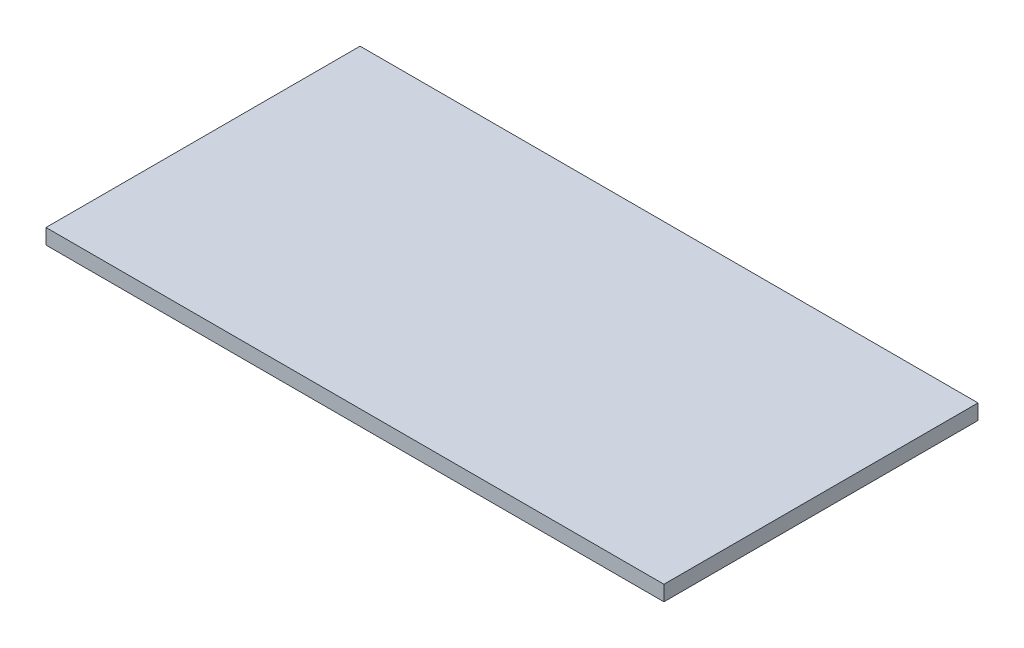
ISO-10303-21;
HEADER;
FILE_DESCRIPTION(('STEP AP214'),'2;1');
FILE_NAME('part.step','',(''),(''),'','','');
FILE_SCHEMA(('AUTOMOTIVE_DESIGN { 1 0 10303 214 1 1 1 1 }'));
ENDSEC;
DATA;
#1=APPLICATION_CONTEXT('core data for automotive mechanical design processes');
#2=APPLICATION_PROTOCOL_DEFINITION('international standard','automotive_design',2000,#1);
#3=PRODUCT_CONTEXT('',#1,'mechanical');
#4=PRODUCT('Part','Part','',(#3));
#5=PRODUCT_RELATED_PRODUCT_CATEGORY('part','',(#4));
#6=PRODUCT_DEFINITION_FORMATION('','',#4);
#7=PRODUCT_DEFINITION_CONTEXT('part definition',#1,'design');
#8=PRODUCT_DEFINITION('design','',#6,#7);
#9=PRODUCT_DEFINITION_SHAPE('','',#8);
#10=(LENGTH_UNIT() NAMED_UNIT(*) SI_UNIT(.MILLI.,.METRE.));
#11=(NAMED_UNIT(*) PLANE_ANGLE_UNIT() SI_UNIT($,.RADIAN.));
#12=(NAMED_UNIT(*) SI_UNIT($,.STERADIAN.) SOLID_ANGLE_UNIT());
#13=UNCERTAINTY_MEASURE_WITH_UNIT(LENGTH_MEASURE(1.E-05),#10,'distance_accuracy_value','');
#14=(GEOMETRIC_REPRESENTATION_CONTEXT(3) GLOBAL_UNCERTAINTY_ASSIGNED_CONTEXT((#13)) GLOBAL_UNIT_ASSIGNED_CONTEXT((#10,
#11,#12)) REPRESENTATION_CONTEXT('',''));
#15=CARTESIAN_POINT('',(0.,0.,0.));
#16=DIRECTION('',(0.,0.,1.));
#17=DIRECTION('',(1.,0.,0.));
#18=AXIS2_PLACEMENT_3D('',#15,#16,#17);
#19=CARTESIAN_POINT('',(0.,5.08,-104.6));
#20=DIRECTION('',(0.,0.,-1.));
#21=DIRECTION('',(-1.,0.,0.));
#22=AXIS2_PLACEMENT_3D('',#19,#20,#21);
#23=PLANE('',#22);
#24=DIRECTION('',(1.,0.,0.));
#25=VECTOR('',#24,1.);
#26=CARTESIAN_POINT('',(0.,0.,-104.6));
#27=LINE('',#26,#25);
#28=CARTESIAN_POINT('',(0.,0.,-104.6));
#29=VERTEX_POINT('',#28);
#30=CARTESIAN_POINT('',(205.8,0.,-104.6));
#31=VERTEX_POINT('',#30);
#32=EDGE_CURVE('E109',#29,#31,#27,.T.);
#33=ORIENTED_EDGE('',*,*,#32,.F.);
#34=DIRECTION('',(0.,-1.,0.));
#35=VECTOR('',#34,1.);
#36=CARTESIAN_POINT('',(0.,5.08,-104.6));
#37=LINE('',#36,#35);
#38=CARTESIAN_POINT('',(0.,5.08,-104.6));
#39=VERTEX_POINT('',#38);
#40=EDGE_CURVE('E11',#39,#29,#37,.T.);
#41=ORIENTED_EDGE('',*,*,#40,.F.);
#42=DIRECTION('',(1.,0.,0.));
#43=VECTOR('',#42,1.);
#44=CARTESIAN_POINT('',(0.,5.08,-104.6));
#45=LINE('',#44,#43);
#46=CARTESIAN_POINT('',(205.8,5.08,-104.6));
#47=VERTEX_POINT('',#46);
#48=EDGE_CURVE('E101',#39,#47,#45,.T.);
#49=ORIENTED_EDGE('',*,*,#48,.T.);
#50=DIRECTION('',(0.,-1.,0.));
#51=VECTOR('',#50,1.);
#52=CARTESIAN_POINT('',(205.8,5.08,-104.6));
#53=LINE('',#52,#51);
#54=EDGE_CURVE('E42',#47,#31,#53,.T.);
#55=ORIENTED_EDGE('',*,*,#54,.T.);
#56=EDGE_LOOP('',(#33,#41,#49,#55));
#57=FACE_BOUND('',#56,.T.);
#58=ADVANCED_FACE('F39',(#57),#23,.T.);
#59=CARTESIAN_POINT('',(0.,5.08,0.));
#60=DIRECTION('',(-1.,0.,0.));
#61=DIRECTION('',(0.,0.,1.));
#62=AXIS2_PLACEMENT_3D('',#59,#60,#61);
#63=PLANE('',#62);
#64=DIRECTION('',(0.,0.,-1.));
#65=VECTOR('',#64,1.);
#66=CARTESIAN_POINT('',(0.,0.,0.));
#67=LINE('',#66,#65);
#68=CARTESIAN_POINT('',(0.,0.,0.));
#69=VERTEX_POINT('',#68);
#70=EDGE_CURVE('E104',#69,#29,#67,.T.);
#71=ORIENTED_EDGE('',*,*,#70,.F.);
#72=DIRECTION('',(0.,-1.,0.));
#73=VECTOR('',#72,1.);
#74=CARTESIAN_POINT('',(0.,5.08,0.));
#75=LINE('',#74,#73);
#76=CARTESIAN_POINT('',(0.,5.08,0.));
#77=VERTEX_POINT('',#76);
#78=EDGE_CURVE('E49',#77,#69,#75,.T.);
#79=ORIENTED_EDGE('',*,*,#78,.F.);
#80=DIRECTION('',(0.,0.,-1.));
#81=VECTOR('',#80,1.);
#82=CARTESIAN_POINT('',(0.,5.08,0.));
#83=LINE('',#82,#81);
#84=EDGE_CURVE('E88',#77,#39,#83,.T.);
#85=ORIENTED_EDGE('',*,*,#84,.T.);
#86=ORIENTED_EDGE('',*,*,#40,.T.);
#87=EDGE_LOOP('',(#71,#79,#85,#86));
#88=FACE_BOUND('',#87,.T.);
#89=ADVANCED_FACE('F125',(#88),#63,.T.);
#90=CARTESIAN_POINT('',(0.,5.08,0.));
#91=DIRECTION('',(0.,0.,-1.));
#92=DIRECTION('',(-1.,0.,0.));
#93=AXIS2_PLACEMENT_3D('',#90,#91,#92);
#94=PLANE('',#93);
#95=DIRECTION('',(1.,0.,0.));
#96=VECTOR('',#95,1.);
#97=CARTESIAN_POINT('',(0.,0.,0.));
#98=LINE('',#97,#96);
#99=CARTESIAN_POINT('',(205.8,0.,0.));
#100=VERTEX_POINT('',#99);
#101=EDGE_CURVE('E94',#69,#100,#98,.T.);
#102=ORIENTED_EDGE('',*,*,#101,.T.);
#103=DIRECTION('',(0.,-1.,0.));
#104=VECTOR('',#103,1.);
#105=CARTESIAN_POINT('',(205.8,5.08,0.));
#106=LINE('',#105,#104);
#107=CARTESIAN_POINT('',(205.8,5.08,0.));
#108=VERTEX_POINT('',#107);
#109=EDGE_CURVE('E92',#108,#100,#106,.T.);
#110=ORIENTED_EDGE('',*,*,#109,.F.);
#111=DIRECTION('',(1.,0.,0.));
#112=VECTOR('',#111,1.);
#113=CARTESIAN_POINT('',(0.,5.08,0.));
#114=LINE('',#113,#112);
#115=EDGE_CURVE('E85',#77,#108,#114,.T.);
#116=ORIENTED_EDGE('',*,*,#115,.F.);
#117=ORIENTED_EDGE('',*,*,#78,.T.);
#118=EDGE_LOOP('',(#102,#110,#116,#117));
#119=FACE_BOUND('',#118,.T.);
#120=ADVANCED_FACE('F93',(#119),#94,.F.);
#121=CARTESIAN_POINT('',(205.8,5.08,0.));
#122=DIRECTION('',(-1.,0.,0.));
#123=DIRECTION('',(0.,0.,1.));
#124=AXIS2_PLACEMENT_3D('',#121,#122,#123);
#125=PLANE('',#124);
#126=DIRECTION('',(0.,0.,-1.));
#127=VECTOR('',#126,1.);
#128=CARTESIAN_POINT('',(205.8,0.,0.));
#129=LINE('',#128,#127);
#130=EDGE_CURVE('E113',#100,#31,#129,.T.);
#131=ORIENTED_EDGE('',*,*,#130,.T.);
#132=ORIENTED_EDGE('',*,*,#54,.F.);
#133=DIRECTION('',(0.,0.,-1.));
#134=VECTOR('',#133,1.);
#135=CARTESIAN_POINT('',(205.8,5.08,0.));
#136=LINE('',#135,#134);
#137=EDGE_CURVE('E82',#108,#47,#136,.T.);
#138=ORIENTED_EDGE('',*,*,#137,.F.);
#139=ORIENTED_EDGE('',*,*,#109,.T.);
#140=EDGE_LOOP('',(#131,#132,#138,#139));
#141=FACE_BOUND('',#140,.T.);
#142=ADVANCED_FACE('F99',(#141),#125,.F.);
#143=CARTESIAN_POINT('',(0.,5.08,0.));
#144=DIRECTION('',(0.,1.,0.));
#145=DIRECTION('',(0.,0.,1.));
#146=AXIS2_PLACEMENT_3D('',#143,#144,#145);
#147=PLANE('',#146);
#148=ORIENTED_EDGE('',*,*,#48,.F.);
#149=ORIENTED_EDGE('',*,*,#84,.F.);
#150=ORIENTED_EDGE('',*,*,#115,.T.);
#151=ORIENTED_EDGE('',*,*,#137,.T.);
#152=EDGE_LOOP('',(#148,#149,#150,#151));
#153=FACE_BOUND('',#152,.T.);
#154=ADVANCED_FACE('F87',(#153),#147,.T.);
#155=CARTESIAN_POINT('',(0.,0.,0.));
#156=DIRECTION('',(0.,1.,0.));
#157=DIRECTION('',(0.,0.,1.));
#158=AXIS2_PLACEMENT_3D('',#155,#156,#157);
#159=PLANE('',#158);
#160=ORIENTED_EDGE('',*,*,#32,.T.);
#161=ORIENTED_EDGE('',*,*,#130,.F.);
#162=ORIENTED_EDGE('',*,*,#101,.F.);
#163=ORIENTED_EDGE('',*,*,#70,.T.);
#164=EDGE_LOOP('',(#160,#161,#162,#163));
#165=FACE_BOUND('',#164,.T.);
#166=ADVANCED_FACE('F124',(#165),#159,.F.);
#167=CLOSED_SHELL('',(#58,#89,#120,#142,#154,#166));
#168=MANIFOLD_SOLID_BREP('B2',#167);
#169=ADVANCED_BREP_SHAPE_REPRESENTATION('',(#18,#168),#14);
#170=SHAPE_DEFINITION_REPRESENTATION(#9,#169);
ENDSEC;
END-ISO-10303-21;
